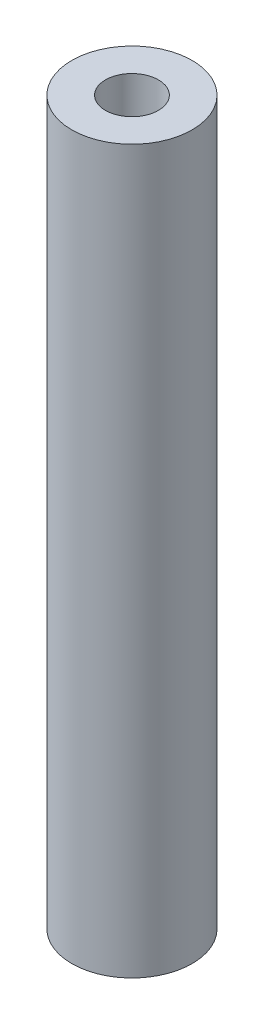
ISO-10303-21;
HEADER;
FILE_DESCRIPTION(('STEP AP214'),'2;1');
FILE_NAME('part.step','',(''),(''),'','','');
FILE_SCHEMA(('AUTOMOTIVE_DESIGN { 1 0 10303 214 1 1 1 1 }'));
ENDSEC;
DATA;
#1=APPLICATION_CONTEXT('core data for automotive mechanical design processes');
#2=APPLICATION_PROTOCOL_DEFINITION('international standard','automotive_design',2000,#1);
#3=PRODUCT_CONTEXT('',#1,'mechanical');
#4=PRODUCT('Part','Part','',(#3));
#5=PRODUCT_RELATED_PRODUCT_CATEGORY('part','',(#4));
#6=PRODUCT_DEFINITION_FORMATION('','',#4);
#7=PRODUCT_DEFINITION_CONTEXT('part definition',#1,'design');
#8=PRODUCT_DEFINITION('design','',#6,#7);
#9=PRODUCT_DEFINITION_SHAPE('','',#8);
#10=(LENGTH_UNIT() NAMED_UNIT(*) SI_UNIT(.MILLI.,.METRE.));
#11=(NAMED_UNIT(*) PLANE_ANGLE_UNIT() SI_UNIT($,.RADIAN.));
#12=(NAMED_UNIT(*) SI_UNIT($,.STERADIAN.) SOLID_ANGLE_UNIT());
#13=UNCERTAINTY_MEASURE_WITH_UNIT(LENGTH_MEASURE(1.E-05),#10,'distance_accuracy_value','');
#14=(GEOMETRIC_REPRESENTATION_CONTEXT(3) GLOBAL_UNCERTAINTY_ASSIGNED_CONTEXT((#13)) GLOBAL_UNIT_ASSIGNED_CONTEXT((#10,
#11,#12)) REPRESENTATION_CONTEXT('',''));
#15=CARTESIAN_POINT('',(0.,0.,0.));
#16=DIRECTION('',(0.,0.,1.));
#17=DIRECTION('',(1.,0.,0.));
#18=AXIS2_PLACEMENT_3D('',#15,#16,#17);
#19=CARTESIAN_POINT('',(0.,60.,0.));
#20=DIRECTION('',(0.,1.,0.));
#21=DIRECTION('',(0.,0.,1.));
#22=AXIS2_PLACEMENT_3D('',#19,#20,#21);
#23=PLANE('',#22);
#24=CARTESIAN_POINT('',(0.,60.,0.));
#25=DIRECTION('',(0.,1.,0.));
#26=DIRECTION('',(0.,0.,1.));
#27=AXIS2_PLACEMENT_3D('',#24,#25,#26);
#28=CIRCLE('',#27,5.);
#29=CARTESIAN_POINT('',(0.,60.,5.));
#30=VERTEX_POINT('',#29);
#31=EDGE_CURVE('E10',#30,#30,#28,.T.);
#32=ORIENTED_EDGE('',*,*,#31,.T.);
#33=EDGE_LOOP('',(#32));
#34=FACE_BOUND('',#33,.T.);
#35=CARTESIAN_POINT('',(0.,60.,0.));
#36=DIRECTION('',(0.,1.,0.));
#37=DIRECTION('',(0.,0.,1.));
#38=AXIS2_PLACEMENT_3D('',#35,#36,#37);
#39=CIRCLE('',#38,2.2);
#40=CARTESIAN_POINT('',(0.,60.,2.2));
#41=VERTEX_POINT('',#40);
#42=EDGE_CURVE('E56',#41,#41,#39,.T.);
#43=ORIENTED_EDGE('',*,*,#42,.F.);
#44=EDGE_LOOP('',(#43));
#45=FACE_BOUND('',#44,.T.);
#46=ADVANCED_FACE('F43',(#34,#45),#23,.T.);
#47=CARTESIAN_POINT('',(0.,0.,0.));
#48=DIRECTION('',(0.,1.,0.));
#49=DIRECTION('',(0.,0.,1.));
#50=AXIS2_PLACEMENT_3D('',#47,#48,#49);
#51=PLANE('',#50);
#52=CARTESIAN_POINT('',(0.,0.,0.));
#53=DIRECTION('',(0.,1.,0.));
#54=DIRECTION('',(0.,0.,1.));
#55=AXIS2_PLACEMENT_3D('',#52,#53,#54);
#56=CIRCLE('',#55,5.);
#57=CARTESIAN_POINT('',(0.,0.,5.));
#58=VERTEX_POINT('',#57);
#59=EDGE_CURVE('E47',#58,#58,#56,.T.);
#60=ORIENTED_EDGE('',*,*,#59,.F.);
#61=EDGE_LOOP('',(#60));
#62=FACE_BOUND('',#61,.T.);
#63=CARTESIAN_POINT('',(0.,0.,0.));
#64=DIRECTION('',(0.,1.,0.));
#65=DIRECTION('',(0.,0.,1.));
#66=AXIS2_PLACEMENT_3D('',#63,#64,#65);
#67=CIRCLE('',#66,2.2);
#68=CARTESIAN_POINT('',(0.,0.,2.2));
#69=VERTEX_POINT('',#68);
#70=EDGE_CURVE('E58',#69,#69,#67,.T.);
#71=ORIENTED_EDGE('',*,*,#70,.T.);
#72=EDGE_LOOP('',(#71));
#73=FACE_BOUND('',#72,.T.);
#74=ADVANCED_FACE('F70',(#62,#73),#51,.F.);
#75=CARTESIAN_POINT('',(0.,60.,0.));
#76=DIRECTION('',(0.,-1.,0.));
#77=DIRECTION('',(0.,0.,-1.));
#78=AXIS2_PLACEMENT_3D('',#75,#76,#77);
#79=CYLINDRICAL_SURFACE('',#78,5.);
#80=ORIENTED_EDGE('',*,*,#31,.F.);
#81=EDGE_LOOP('',(#80));
#82=FACE_BOUND('',#81,.T.);
#83=ORIENTED_EDGE('',*,*,#59,.T.);
#84=EDGE_LOOP('',(#83));
#85=FACE_BOUND('',#84,.T.);
#86=ADVANCED_FACE('F45',(#82,#85),#79,.T.);
#87=CARTESIAN_POINT('',(0.,60.,0.));
#88=DIRECTION('',(0.,-1.,0.));
#89=DIRECTION('',(0.,0.,-1.));
#90=AXIS2_PLACEMENT_3D('',#87,#88,#89);
#91=CYLINDRICAL_SURFACE('',#90,2.2);
#92=ORIENTED_EDGE('',*,*,#42,.T.);
#93=EDGE_LOOP('',(#92));
#94=FACE_BOUND('',#93,.T.);
#95=ORIENTED_EDGE('',*,*,#70,.F.);
#96=EDGE_LOOP('',(#95));
#97=FACE_BOUND('',#96,.T.);
#98=ADVANCED_FACE('F66',(#94,#97),#91,.F.);
#99=CLOSED_SHELL('',(#46,#74,#86,#98));
#100=MANIFOLD_SOLID_BREP('B2',#99);
#101=ADVANCED_BREP_SHAPE_REPRESENTATION('',(#18,#100),#14);
#102=SHAPE_DEFINITION_REPRESENTATION(#9,#101);
ENDSEC;
END-ISO-10303-21;
